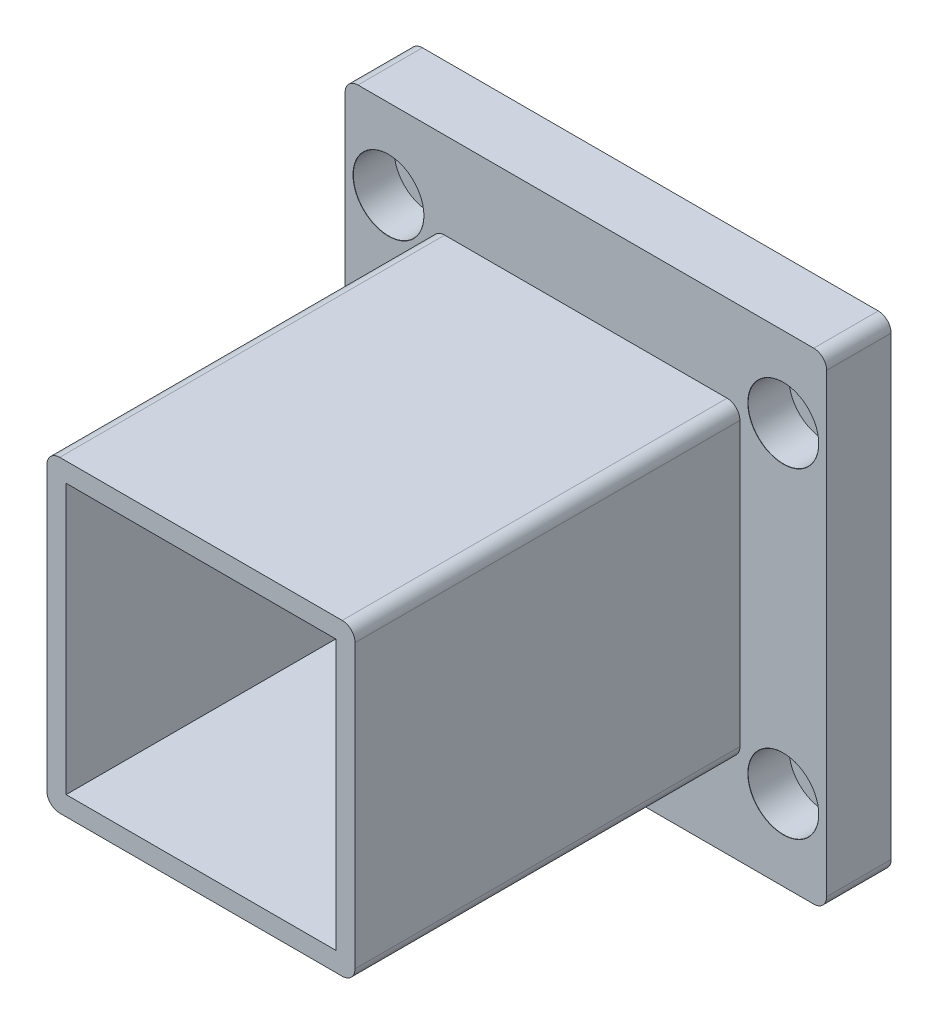
ISO-10303-21;
HEADER;
FILE_DESCRIPTION(('STEP AP214'),'2;1');
FILE_NAME('part.step','',(''),(''),'','','');
FILE_SCHEMA(('AUTOMOTIVE_DESIGN { 1 0 10303 214 1 1 1 1 }'));
ENDSEC;
DATA;
#1=APPLICATION_CONTEXT('core data for automotive mechanical design processes');
#2=APPLICATION_PROTOCOL_DEFINITION('international standard','automotive_design',2000,#1);
#3=PRODUCT_CONTEXT('',#1,'mechanical');
#4=PRODUCT('Part','Part','',(#3));
#5=PRODUCT_RELATED_PRODUCT_CATEGORY('part','',(#4));
#6=PRODUCT_DEFINITION_FORMATION('','',#4);
#7=PRODUCT_DEFINITION_CONTEXT('part definition',#1,'design');
#8=PRODUCT_DEFINITION('design','',#6,#7);
#9=PRODUCT_DEFINITION_SHAPE('','',#8);
#10=(LENGTH_UNIT() NAMED_UNIT(*) SI_UNIT(.MILLI.,.METRE.));
#11=(NAMED_UNIT(*) PLANE_ANGLE_UNIT() SI_UNIT($,.RADIAN.));
#12=(NAMED_UNIT(*) SI_UNIT($,.STERADIAN.) SOLID_ANGLE_UNIT());
#13=UNCERTAINTY_MEASURE_WITH_UNIT(LENGTH_MEASURE(1.E-05),#10,'distance_accuracy_value','');
#14=(GEOMETRIC_REPRESENTATION_CONTEXT(3) GLOBAL_UNCERTAINTY_ASSIGNED_CONTEXT((#13)) GLOBAL_UNIT_ASSIGNED_CONTEXT((#10,
#11,#12)) REPRESENTATION_CONTEXT('',''));
#15=CARTESIAN_POINT('',(0.,0.,0.));
#16=DIRECTION('',(0.,0.,1.));
#17=DIRECTION('',(1.,0.,0.));
#18=AXIS2_PLACEMENT_3D('',#15,#16,#17);
#19=CARTESIAN_POINT('',(0.,-22.0480038732877,65.));
#20=DIRECTION('',(0.,1.,0.));
#21=DIRECTION('',(-1.,0.,0.));
#22=AXIS2_PLACEMENT_3D('',#19,#20,#21);
#23=PLANE('',#22);
#24=DIRECTION('',(0.,0.,-1.));
#25=VECTOR('',#24,1.);
#26=CARTESIAN_POINT('',(14.8539056242526,-22.0480038732877,65.));
#27=LINE('',#26,#25);
#28=CARTESIAN_POINT('',(14.8539056242526,-22.0480038732877,65.));
#29=VERTEX_POINT('',#28);
#30=CARTESIAN_POINT('',(14.8539056242526,-22.0480038732877,0.));
#31=VERTEX_POINT('',#30);
#32=EDGE_CURVE('E238',#29,#31,#27,.T.);
#33=ORIENTED_EDGE('',*,*,#32,.T.);
#34=DIRECTION('',(1.,0.,0.));
#35=VECTOR('',#34,1.);
#36=CARTESIAN_POINT('',(0.,-22.0480038732877,0.));
#37=LINE('',#36,#35);
#38=CARTESIAN_POINT('',(-27.1460943757474,-22.0480038732877,0.));
#39=VERTEX_POINT('',#38);
#40=EDGE_CURVE('E232',#39,#31,#37,.T.);
#41=ORIENTED_EDGE('',*,*,#40,.F.);
#42=DIRECTION('',(0.,0.,-1.));
#43=VECTOR('',#42,1.);
#44=CARTESIAN_POINT('',(-27.1460943757474,-22.0480038732877,65.));
#45=LINE('',#44,#43);
#46=CARTESIAN_POINT('',(-27.1460943757474,-22.0480038732877,65.));
#47=VERTEX_POINT('',#46);
#48=EDGE_CURVE('E212',#47,#39,#45,.T.);
#49=ORIENTED_EDGE('',*,*,#48,.F.);
#50=DIRECTION('',(1.,0.,0.));
#51=VECTOR('',#50,1.);
#52=CARTESIAN_POINT('',(0.,-22.0480038732877,65.));
#53=LINE('',#52,#51);
#54=EDGE_CURVE('E393',#47,#29,#53,.T.);
#55=ORIENTED_EDGE('',*,*,#54,.T.);
#56=EDGE_LOOP('',(#33,#41,#49,#55));
#57=FACE_BOUND('',#56,.T.);
#58=ADVANCED_FACE('F73',(#57),#23,.T.);
#59=CARTESIAN_POINT('',(-27.1460943757474,0.,65.));
#60=DIRECTION('',(-1.,0.,0.));
#61=DIRECTION('',(0.,0.,1.));
#62=AXIS2_PLACEMENT_3D('',#59,#60,#61);
#63=PLANE('',#62);
#64=ORIENTED_EDGE('',*,*,#48,.T.);
#65=DIRECTION('',(0.,1.,0.));
#66=VECTOR('',#65,1.);
#67=CARTESIAN_POINT('',(-27.1460943757474,0.,0.));
#68=LINE('',#67,#66);
#69=CARTESIAN_POINT('',(-27.1460943757474,19.9519961267123,0.));
#70=VERTEX_POINT('',#69);
#71=EDGE_CURVE('E216',#39,#70,#68,.T.);
#72=ORIENTED_EDGE('',*,*,#71,.T.);
#73=DIRECTION('',(0.,0.,-1.));
#74=VECTOR('',#73,1.);
#75=CARTESIAN_POINT('',(-27.1460943757474,19.9519961267123,65.));
#76=LINE('',#75,#74);
#77=CARTESIAN_POINT('',(-27.1460943757474,19.9519961267123,65.));
#78=VERTEX_POINT('',#77);
#79=EDGE_CURVE('E225',#78,#70,#76,.T.);
#80=ORIENTED_EDGE('',*,*,#79,.F.);
#81=DIRECTION('',(0.,1.,0.));
#82=VECTOR('',#81,1.);
#83=CARTESIAN_POINT('',(-27.1460943757474,0.,65.));
#84=LINE('',#83,#82);
#85=EDGE_CURVE('E218',#47,#78,#84,.T.);
#86=ORIENTED_EDGE('',*,*,#85,.F.);
#87=EDGE_LOOP('',(#64,#72,#80,#86));
#88=FACE_BOUND('',#87,.T.);
#89=ADVANCED_FACE('F214',(#88),#63,.F.);
#90=CARTESIAN_POINT('',(0.,19.9519961267123,65.));
#91=DIRECTION('',(0.,1.,0.));
#92=DIRECTION('',(-1.,0.,0.));
#93=AXIS2_PLACEMENT_3D('',#90,#91,#92);
#94=PLANE('',#93);
#95=ORIENTED_EDGE('',*,*,#79,.T.);
#96=DIRECTION('',(1.,0.,0.));
#97=VECTOR('',#96,1.);
#98=CARTESIAN_POINT('',(0.,19.9519961267123,0.));
#99=LINE('',#98,#97);
#100=CARTESIAN_POINT('',(14.8539056242526,19.9519961267123,0.));
#101=VERTEX_POINT('',#100);
#102=EDGE_CURVE('E235',#70,#101,#99,.T.);
#103=ORIENTED_EDGE('',*,*,#102,.T.);
#104=DIRECTION('',(0.,0.,-1.));
#105=VECTOR('',#104,1.);
#106=CARTESIAN_POINT('',(14.8539056242526,19.9519961267123,65.));
#107=LINE('',#106,#105);
#108=CARTESIAN_POINT('',(14.8539056242526,19.9519961267123,65.));
#109=VERTEX_POINT('',#108);
#110=EDGE_CURVE('E258',#109,#101,#107,.T.);
#111=ORIENTED_EDGE('',*,*,#110,.F.);
#112=DIRECTION('',(1.,0.,0.));
#113=VECTOR('',#112,1.);
#114=CARTESIAN_POINT('',(0.,19.9519961267123,65.));
#115=LINE('',#114,#113);
#116=EDGE_CURVE('E403',#78,#109,#115,.T.);
#117=ORIENTED_EDGE('',*,*,#116,.F.);
#118=EDGE_LOOP('',(#95,#103,#111,#117));
#119=FACE_BOUND('',#118,.T.);
#120=ADVANCED_FACE('F412',(#119),#94,.F.);
#121=CARTESIAN_POINT('',(0.,22.9519961267123,65.));
#122=DIRECTION('',(0.,1.,0.));
#123=DIRECTION('',(-1.,0.,0.));
#124=AXIS2_PLACEMENT_3D('',#121,#122,#123);
#125=PLANE('',#124);
#126=DIRECTION('',(1.,0.,0.));
#127=VECTOR('',#126,1.);
#128=CARTESIAN_POINT('',(0.,22.9519961267123,5.04707913219928));
#129=LINE('',#128,#127);
#130=CARTESIAN_POINT('',(-28.1460943757474,22.9519961267123,5.04707913219928));
#131=VERTEX_POINT('',#130);
#132=CARTESIAN_POINT('',(15.8539056242526,22.9519961267123,5.04707913219928));
#133=VERTEX_POINT('',#132);
#134=EDGE_CURVE('E500',#131,#133,#129,.T.);
#135=ORIENTED_EDGE('',*,*,#134,.F.);
#136=DIRECTION('',(0.,0.,-1.));
#137=VECTOR('',#136,1.);
#138=CARTESIAN_POINT('',(-28.1460943757474,22.9519961267123,65.));
#139=LINE('',#138,#137);
#140=CARTESIAN_POINT('',(-28.1460943757474,22.9519961267123,65.));
#141=VERTEX_POINT('',#140);
#142=EDGE_CURVE('E273',#131,#141,#139,.F.);
#143=ORIENTED_EDGE('',*,*,#142,.T.);
#144=DIRECTION('',(1.,0.,0.));
#145=VECTOR('',#144,1.);
#146=CARTESIAN_POINT('',(0.,22.9519961267123,65.));
#147=LINE('',#146,#145);
#148=CARTESIAN_POINT('',(15.8539056242526,22.9519961267123,65.));
#149=VERTEX_POINT('',#148);
#150=EDGE_CURVE('E255',#141,#149,#147,.T.);
#151=ORIENTED_EDGE('',*,*,#150,.T.);
#152=DIRECTION('',(0.,0.,-1.));
#153=VECTOR('',#152,1.);
#154=CARTESIAN_POINT('',(15.8539056242526,22.9519961267123,5.04707913219928));
#155=LINE('',#154,#153);
#156=EDGE_CURVE('E269',#149,#133,#155,.T.);
#157=ORIENTED_EDGE('',*,*,#156,.T.);
#158=EDGE_LOOP('',(#135,#143,#151,#157));
#159=FACE_BOUND('',#158,.T.);
#160=ADVANCED_FACE('F414',(#159),#125,.T.);
#161=CARTESIAN_POINT('',(-30.1460943757474,0.,65.));
#162=DIRECTION('',(-1.,0.,0.));
#163=DIRECTION('',(0.,0.,1.));
#164=AXIS2_PLACEMENT_3D('',#161,#162,#163);
#165=PLANE('',#164);
#166=DIRECTION('',(0.,1.,0.));
#167=VECTOR('',#166,1.);
#168=CARTESIAN_POINT('',(-30.1460943757474,0.,65.));
#169=LINE('',#168,#167);
#170=CARTESIAN_POINT('',(-30.1460943757474,-23.0480038732877,65.));
#171=VERTEX_POINT('',#170);
#172=CARTESIAN_POINT('',(-30.1460943757474,20.9519961267123,65.));
#173=VERTEX_POINT('',#172);
#174=EDGE_CURVE('E398',#171,#173,#169,.T.);
#175=ORIENTED_EDGE('',*,*,#174,.T.);
#176=DIRECTION('',(0.,0.,-1.));
#177=VECTOR('',#176,1.);
#178=CARTESIAN_POINT('',(-30.1460943757474,20.9519961267123,65.));
#179=LINE('',#178,#177);
#180=CARTESIAN_POINT('',(-30.1460943757474,20.9519961267123,5.04707913219928));
#181=VERTEX_POINT('',#180);
#182=EDGE_CURVE('E265',#173,#181,#179,.T.);
#183=ORIENTED_EDGE('',*,*,#182,.T.);
#184=DIRECTION('',(0.,1.,0.));
#185=VECTOR('',#184,1.);
#186=CARTESIAN_POINT('',(-30.1460943757474,0.,5.04707913219928));
#187=LINE('',#186,#185);
#188=CARTESIAN_POINT('',(-30.1460943757474,-23.0480038732877,5.04707913219928));
#189=VERTEX_POINT('',#188);
#190=EDGE_CURVE('E376',#189,#181,#187,.T.);
#191=ORIENTED_EDGE('',*,*,#190,.F.);
#192=DIRECTION('',(0.,0.,-1.));
#193=VECTOR('',#192,1.);
#194=CARTESIAN_POINT('',(-30.1460943757474,-23.0480038732877,65.));
#195=LINE('',#194,#193);
#196=EDGE_CURVE('E224',#189,#171,#195,.F.);
#197=ORIENTED_EDGE('',*,*,#196,.T.);
#198=EDGE_LOOP('',(#175,#183,#191,#197));
#199=FACE_BOUND('',#198,.T.);
#200=ADVANCED_FACE('F421',(#199),#165,.T.);
#201=CARTESIAN_POINT('',(0.,-25.0480038732877,65.));
#202=DIRECTION('',(0.,1.,0.));
#203=DIRECTION('',(-1.,0.,0.));
#204=AXIS2_PLACEMENT_3D('',#201,#202,#203);
#205=PLANE('',#204);
#206=DIRECTION('',(1.,0.,0.));
#207=VECTOR('',#206,1.);
#208=CARTESIAN_POINT('',(0.,-25.0480038732877,65.));
#209=LINE('',#208,#207);
#210=CARTESIAN_POINT('',(-28.1460943757474,-25.0480038732877,65.));
#211=VERTEX_POINT('',#210);
#212=CARTESIAN_POINT('',(15.8539056242526,-25.0480038732877,65.));
#213=VERTEX_POINT('',#212);
#214=EDGE_CURVE('E388',#211,#213,#209,.T.);
#215=ORIENTED_EDGE('',*,*,#214,.F.);
#216=DIRECTION('',(0.,0.,-1.));
#217=VECTOR('',#216,1.);
#218=CARTESIAN_POINT('',(-28.1460943757474,-25.0480038732877,5.04707913219928));
#219=LINE('',#218,#217);
#220=CARTESIAN_POINT('',(-28.1460943757474,-25.0480038732877,5.04707913219928));
#221=VERTEX_POINT('',#220);
#222=EDGE_CURVE('E291',#211,#221,#219,.T.);
#223=ORIENTED_EDGE('',*,*,#222,.T.);
#224=DIRECTION('',(1.,0.,0.));
#225=VECTOR('',#224,1.);
#226=CARTESIAN_POINT('',(0.,-25.0480038732877,5.04707913219928));
#227=LINE('',#226,#225);
#228=CARTESIAN_POINT('',(15.8539056242526,-25.0480038732877,5.04707913219928));
#229=VERTEX_POINT('',#228);
#230=EDGE_CURVE('E364',#221,#229,#227,.T.);
#231=ORIENTED_EDGE('',*,*,#230,.T.);
#232=DIRECTION('',(0.,0.,-1.));
#233=VECTOR('',#232,1.);
#234=CARTESIAN_POINT('',(15.8539056242526,-25.0480038732877,65.));
#235=LINE('',#234,#233);
#236=EDGE_CURVE('E288',#229,#213,#235,.F.);
#237=ORIENTED_EDGE('',*,*,#236,.T.);
#238=EDGE_LOOP('',(#215,#223,#231,#237));
#239=FACE_BOUND('',#238,.T.);
#240=ADVANCED_FACE('F372',(#239),#205,.F.);
#241=CARTESIAN_POINT('',(17.8539056242526,0.,65.));
#242=DIRECTION('',(-1.,0.,0.));
#243=DIRECTION('',(0.,0.,1.));
#244=AXIS2_PLACEMENT_3D('',#241,#242,#243);
#245=PLANE('',#244);
#246=DIRECTION('',(0.,1.,0.));
#247=VECTOR('',#246,1.);
#248=CARTESIAN_POINT('',(17.8539056242526,0.,65.));
#249=LINE('',#248,#247);
#250=CARTESIAN_POINT('',(17.8539056242526,-23.0480038732877,65.));
#251=VERTEX_POINT('',#250);
#252=CARTESIAN_POINT('',(17.8539056242526,20.9519961267123,65.));
#253=VERTEX_POINT('',#252);
#254=EDGE_CURVE('E386',#251,#253,#249,.T.);
#255=ORIENTED_EDGE('',*,*,#254,.F.);
#256=DIRECTION('',(0.,0.,-1.));
#257=VECTOR('',#256,1.);
#258=CARTESIAN_POINT('',(17.8539056242526,-23.0480038732877,65.));
#259=LINE('',#258,#257);
#260=CARTESIAN_POINT('',(17.8539056242526,-23.0480038732877,5.04707913219928));
#261=VERTEX_POINT('',#260);
#262=EDGE_CURVE('E298',#251,#261,#259,.T.);
#263=ORIENTED_EDGE('',*,*,#262,.T.);
#264=DIRECTION('',(0.,1.,0.));
#265=VECTOR('',#264,1.);
#266=CARTESIAN_POINT('',(17.8539056242526,0.,5.04707913219928));
#267=LINE('',#266,#265);
#268=CARTESIAN_POINT('',(17.8539056242526,20.9519961267123,5.04707913219928));
#269=VERTEX_POINT('',#268);
#270=EDGE_CURVE('E366',#261,#269,#267,.T.);
#271=ORIENTED_EDGE('',*,*,#270,.T.);
#272=DIRECTION('',(0.,0.,-1.));
#273=VECTOR('',#272,1.);
#274=CARTESIAN_POINT('',(17.8539056242526,20.9519961267123,65.));
#275=LINE('',#274,#273);
#276=EDGE_CURVE('E295',#269,#253,#275,.F.);
#277=ORIENTED_EDGE('',*,*,#276,.T.);
#278=EDGE_LOOP('',(#255,#263,#271,#277));
#279=FACE_BOUND('',#278,.T.);
#280=ADVANCED_FACE('F390',(#279),#245,.F.);
#281=CARTESIAN_POINT('',(14.8539056242526,0.,65.));
#282=DIRECTION('',(-1.,0.,0.));
#283=DIRECTION('',(0.,0.,1.));
#284=AXIS2_PLACEMENT_3D('',#281,#282,#283);
#285=PLANE('',#284);
#286=ORIENTED_EDGE('',*,*,#110,.T.);
#287=DIRECTION('',(0.,1.,0.));
#288=VECTOR('',#287,1.);
#289=CARTESIAN_POINT('',(14.8539056242526,0.,0.));
#290=LINE('',#289,#288);
#291=EDGE_CURVE('E252',#31,#101,#290,.T.);
#292=ORIENTED_EDGE('',*,*,#291,.F.);
#293=ORIENTED_EDGE('',*,*,#32,.F.);
#294=DIRECTION('',(0.,1.,0.));
#295=VECTOR('',#294,1.);
#296=CARTESIAN_POINT('',(14.8539056242526,0.,65.));
#297=LINE('',#296,#295);
#298=EDGE_CURVE('E247',#29,#109,#297,.T.);
#299=ORIENTED_EDGE('',*,*,#298,.T.);
#300=EDGE_LOOP('',(#286,#292,#293,#299));
#301=FACE_BOUND('',#300,.T.);
#302=ADVANCED_FACE('F410',(#301),#285,.T.);
#303=CARTESIAN_POINT('',(0.,0.,65.));
#304=DIRECTION('',(0.,0.,1.));
#305=DIRECTION('',(1.,0.,0.));
#306=AXIS2_PLACEMENT_3D('',#303,#304,#305);
#307=PLANE('',#306);
#308=ORIENTED_EDGE('',*,*,#150,.F.);
#309=CARTESIAN_POINT('',(-28.1460943757474,20.9519961267123,65.));
#310=DIRECTION('',(0.,0.,1.));
#311=DIRECTION('',(1.,0.,0.));
#312=AXIS2_PLACEMENT_3D('',#309,#310,#311);
#313=CIRCLE('',#312,2.);
#314=EDGE_CURVE('E285',#141,#173,#313,.T.);
#315=ORIENTED_EDGE('',*,*,#314,.T.);
#316=ORIENTED_EDGE('',*,*,#174,.F.);
#317=CARTESIAN_POINT('',(-28.1460943757474,-23.0480038732877,65.));
#318=DIRECTION('',(0.,0.,1.));
#319=DIRECTION('',(1.,0.,0.));
#320=AXIS2_PLACEMENT_3D('',#317,#318,#319);
#321=CIRCLE('',#320,2.);
#322=EDGE_CURVE('E282',#171,#211,#321,.T.);
#323=ORIENTED_EDGE('',*,*,#322,.T.);
#324=ORIENTED_EDGE('',*,*,#214,.T.);
#325=CARTESIAN_POINT('',(15.8539056242526,-23.0480038732877,65.));
#326=DIRECTION('',(0.,0.,1.));
#327=DIRECTION('',(1.,0.,0.));
#328=AXIS2_PLACEMENT_3D('',#325,#326,#327);
#329=CIRCLE('',#328,2.);
#330=EDGE_CURVE('E279',#213,#251,#329,.T.);
#331=ORIENTED_EDGE('',*,*,#330,.T.);
#332=ORIENTED_EDGE('',*,*,#254,.T.);
#333=CARTESIAN_POINT('',(15.8539056242526,20.9519961267123,65.));
#334=DIRECTION('',(0.,0.,1.));
#335=DIRECTION('',(1.,0.,0.));
#336=AXIS2_PLACEMENT_3D('',#333,#334,#335);
#337=CIRCLE('',#336,2.);
#338=EDGE_CURVE('E276',#253,#149,#337,.T.);
#339=ORIENTED_EDGE('',*,*,#338,.T.);
#340=EDGE_LOOP('',(#308,#315,#316,#323,#324,#331,#332,#339));
#341=FACE_BOUND('',#340,.T.);
#342=ORIENTED_EDGE('',*,*,#54,.F.);
#343=ORIENTED_EDGE('',*,*,#85,.T.);
#344=ORIENTED_EDGE('',*,*,#116,.T.);
#345=ORIENTED_EDGE('',*,*,#298,.F.);
#346=EDGE_LOOP('',(#342,#343,#344,#345));
#347=FACE_BOUND('',#346,.T.);
#348=ADVANCED_FACE('F384',(#341,#347),#307,.T.);
#349=CARTESIAN_POINT('',(0.,0.,0.));
#350=DIRECTION('',(0.,0.,-1.));
#351=DIRECTION('',(-1.,0.,0.));
#352=AXIS2_PLACEMENT_3D('',#349,#350,#351);
#353=PLANE('',#352);
#354=ORIENTED_EDGE('',*,*,#71,.F.);
#355=ORIENTED_EDGE('',*,*,#40,.T.);
#356=ORIENTED_EDGE('',*,*,#291,.T.);
#357=ORIENTED_EDGE('',*,*,#102,.F.);
#358=EDGE_LOOP('',(#354,#355,#356,#357));
#359=FACE_BOUND('',#358,.T.);
#360=ADVANCED_FACE('F230',(#359),#353,.F.);
#361=CARTESIAN_POINT('',(0.,0.,5.04707913219928));
#362=DIRECTION('',(0.,0.,1.));
#363=DIRECTION('',(1.,0.,0.));
#364=AXIS2_PLACEMENT_3D('',#361,#362,#363);
#365=PLANE('',#364);
#366=CARTESIAN_POINT('',(-36.8960943757474,23.9519961267123,5.04707913219928));
#367=DIRECTION('',(0.,0.,1.));
#368=DIRECTION('',(1.,0.,0.));
#369=AXIS2_PLACEMENT_3D('',#366,#367,#368);
#370=CIRCLE('',#369,5.525);
#371=CARTESIAN_POINT('',(-31.3710943757474,23.9519961267123,5.04707913219928));
#372=VERTEX_POINT('',#371);
#373=EDGE_CURVE('E975',#372,#372,#370,.T.);
#374=ORIENTED_EDGE('',*,*,#373,.F.);
#375=EDGE_LOOP('',(#374));
#376=FACE_BOUND('',#375,.T.);
#377=CARTESIAN_POINT('',(-36.8960943757474,-26.0480038732877,5.04707913219928));
#378=DIRECTION('',(0.,0.,1.));
#379=DIRECTION('',(1.,0.,0.));
#380=AXIS2_PLACEMENT_3D('',#377,#378,#379);
#381=CIRCLE('',#380,5.525);
#382=CARTESIAN_POINT('',(-31.3710943757474,-26.0480038732877,5.04707913219928));
#383=VERTEX_POINT('',#382);
#384=EDGE_CURVE('E957',#383,#383,#381,.T.);
#385=ORIENTED_EDGE('',*,*,#384,.F.);
#386=EDGE_LOOP('',(#385));
#387=FACE_BOUND('',#386,.T.);
#388=CARTESIAN_POINT('',(24.6039056242526,23.9519961267123,5.04707913219928));
#389=DIRECTION('',(0.,0.,1.));
#390=DIRECTION('',(1.,0.,0.));
#391=AXIS2_PLACEMENT_3D('',#388,#389,#390);
#392=CIRCLE('',#391,5.525);
#393=CARTESIAN_POINT('',(30.1289056242526,23.9519961267123,5.04707913219928));
#394=VERTEX_POINT('',#393);
#395=EDGE_CURVE('E939',#394,#394,#392,.T.);
#396=ORIENTED_EDGE('',*,*,#395,.F.);
#397=EDGE_LOOP('',(#396));
#398=FACE_BOUND('',#397,.T.);
#399=CARTESIAN_POINT('',(24.6039056242526,-26.0480038732877,5.04707913219928));
#400=DIRECTION('',(0.,0.,1.));
#401=DIRECTION('',(1.,0.,0.));
#402=AXIS2_PLACEMENT_3D('',#399,#400,#401);
#403=CIRCLE('',#402,5.525);
#404=CARTESIAN_POINT('',(30.1289056242526,-26.0480038732877,5.04707913219928));
#405=VERTEX_POINT('',#404);
#406=EDGE_CURVE('E921',#405,#405,#403,.T.);
#407=ORIENTED_EDGE('',*,*,#406,.F.);
#408=EDGE_LOOP('',(#407));
#409=FACE_BOUND('',#408,.T.);
#410=ORIENTED_EDGE('',*,*,#230,.F.);
#411=CARTESIAN_POINT('',(-28.1460943757474,-23.0480038732877,5.04707913219928));
#412=DIRECTION('',(0.,0.,1.));
#413=DIRECTION('',(1.,0.,0.));
#414=AXIS2_PLACEMENT_3D('',#411,#412,#413);
#415=CIRCLE('',#414,2.);
#416=EDGE_CURVE('E355',#221,#189,#415,.F.);
#417=ORIENTED_EDGE('',*,*,#416,.T.);
#418=ORIENTED_EDGE('',*,*,#190,.T.);
#419=CARTESIAN_POINT('',(-28.1460943757474,20.9519961267123,5.04707913219928));
#420=DIRECTION('',(0.,0.,1.));
#421=DIRECTION('',(1.,0.,0.));
#422=AXIS2_PLACEMENT_3D('',#419,#420,#421);
#423=CIRCLE('',#422,2.);
#424=EDGE_CURVE('E352',#181,#131,#423,.F.);
#425=ORIENTED_EDGE('',*,*,#424,.T.);
#426=ORIENTED_EDGE('',*,*,#134,.T.);
#427=CARTESIAN_POINT('',(15.8539056242526,20.9519961267123,5.04707913219928));
#428=DIRECTION('',(0.,0.,1.));
#429=DIRECTION('',(1.,0.,0.));
#430=AXIS2_PLACEMENT_3D('',#427,#428,#429);
#431=CIRCLE('',#430,2.);
#432=EDGE_CURVE('E12',#133,#269,#431,.F.);
#433=ORIENTED_EDGE('',*,*,#432,.T.);
#434=ORIENTED_EDGE('',*,*,#270,.F.);
#435=CARTESIAN_POINT('',(15.8539056242526,-23.0480038732877,5.04707913219928));
#436=DIRECTION('',(0.,0.,1.));
#437=DIRECTION('',(1.,0.,0.));
#438=AXIS2_PLACEMENT_3D('',#435,#436,#437);
#439=CIRCLE('',#438,2.);
#440=EDGE_CURVE('E82',#261,#229,#439,.F.);
#441=ORIENTED_EDGE('',*,*,#440,.T.);
#442=EDGE_LOOP('',(#410,#417,#418,#425,#426,#433,#434,#441));
#443=FACE_BOUND('',#442,.T.);
#444=DIRECTION('',(0.,1.,0.));
#445=VECTOR('',#444,1.);
#446=CARTESIAN_POINT('',(31.3539056242527,36.4519961267123,5.04707913219928));
#447=LINE('',#446,#445);
#448=CARTESIAN_POINT('',(31.3539056242526,-36.5480038732877,5.04707913219928));
#449=VERTEX_POINT('',#448);
#450=CARTESIAN_POINT('',(31.3539056242527,34.4519961267123,5.04707913219928));
#451=VERTEX_POINT('',#450);
#452=EDGE_CURVE('E483',#449,#451,#447,.T.);
#453=ORIENTED_EDGE('',*,*,#452,.T.);
#454=CARTESIAN_POINT('',(29.3539056242526,34.4519961267123,5.04707913219928));
#455=DIRECTION('',(0.,0.,1.));
#456=DIRECTION('',(1.,0.,0.));
#457=AXIS2_PLACEMENT_3D('',#454,#455,#456);
#458=CIRCLE('',#457,2.);
#459=CARTESIAN_POINT('',(29.3539056242526,36.4519961267123,5.04707913219928));
#460=VERTEX_POINT('',#459);
#461=EDGE_CURVE('E318',#451,#460,#458,.T.);
#462=ORIENTED_EDGE('',*,*,#461,.T.);
#463=DIRECTION('',(-1.,0.,0.));
#464=VECTOR('',#463,1.);
#465=CARTESIAN_POINT('',(-43.6460943757474,36.4519961267123,5.04707913219928));
#466=LINE('',#465,#464);
#467=CARTESIAN_POINT('',(-41.6460943757474,36.4519961267123,5.04707913219928));
#468=VERTEX_POINT('',#467);
#469=EDGE_CURVE('E492',#460,#468,#466,.T.);
#470=ORIENTED_EDGE('',*,*,#469,.T.);
#471=CARTESIAN_POINT('',(-41.6460943757474,34.4519961267123,5.04707913219928));
#472=DIRECTION('',(0.,0.,1.));
#473=DIRECTION('',(1.,0.,0.));
#474=AXIS2_PLACEMENT_3D('',#471,#472,#473);
#475=CIRCLE('',#474,2.);
#476=CARTESIAN_POINT('',(-43.6460943757474,34.4519961267123,5.04707913219928));
#477=VERTEX_POINT('',#476);
#478=EDGE_CURVE('E315',#468,#477,#475,.T.);
#479=ORIENTED_EDGE('',*,*,#478,.T.);
#480=DIRECTION('',(0.,-1.,0.));
#481=VECTOR('',#480,1.);
#482=CARTESIAN_POINT('',(-43.6460943757474,36.4519961267123,5.04707913219928));
#483=LINE('',#482,#481);
#484=CARTESIAN_POINT('',(-43.6460943757473,-36.5480038732877,5.04707913219928));
#485=VERTEX_POINT('',#484);
#486=EDGE_CURVE('E472',#477,#485,#483,.T.);
#487=ORIENTED_EDGE('',*,*,#486,.T.);
#488=CARTESIAN_POINT('',(-41.6460943757474,-36.5480038732877,5.04707913219928));
#489=DIRECTION('',(0.,0.,1.));
#490=DIRECTION('',(1.,0.,0.));
#491=AXIS2_PLACEMENT_3D('',#488,#489,#490);
#492=CIRCLE('',#491,2.);
#493=CARTESIAN_POINT('',(-41.6460943757474,-38.5480038732877,5.04707913219928));
#494=VERTEX_POINT('',#493);
#495=EDGE_CURVE('E312',#485,#494,#492,.T.);
#496=ORIENTED_EDGE('',*,*,#495,.T.);
#497=DIRECTION('',(1.,0.,0.));
#498=VECTOR('',#497,1.);
#499=CARTESIAN_POINT('',(-43.6460943757473,-38.5480038732877,5.04707913219928));
#500=LINE('',#499,#498);
#501=CARTESIAN_POINT('',(29.3539056242526,-38.5480038732877,5.04707913219928));
#502=VERTEX_POINT('',#501);
#503=EDGE_CURVE('E478',#494,#502,#500,.T.);
#504=ORIENTED_EDGE('',*,*,#503,.T.);
#505=CARTESIAN_POINT('',(29.3539056242526,-36.5480038732877,5.04707913219928));
#506=DIRECTION('',(0.,0.,1.));
#507=DIRECTION('',(1.,0.,0.));
#508=AXIS2_PLACEMENT_3D('',#505,#506,#507);
#509=CIRCLE('',#508,2.);
#510=EDGE_CURVE('E309',#502,#449,#509,.T.);
#511=ORIENTED_EDGE('',*,*,#510,.T.);
#512=EDGE_LOOP('',(#453,#462,#470,#479,#487,#496,#504,#511));
#513=FACE_BOUND('',#512,.T.);
#514=ADVANCED_FACE('F362',(#376,#387,#398,#409,#443,#513),#365,.T.);
#515=CARTESIAN_POINT('',(0.,0.,-5.));
#516=DIRECTION('',(0.,0.,-1.));
#517=DIRECTION('',(-1.,0.,0.));
#518=AXIS2_PLACEMENT_3D('',#515,#516,#517);
#519=PLANE('',#518);
#520=CARTESIAN_POINT('',(-36.8960943757474,23.9519961267123,-5.));
#521=DIRECTION('',(0.,0.,1.));
#522=DIRECTION('',(1.,0.,0.));
#523=AXIS2_PLACEMENT_3D('',#520,#521,#522);
#524=CIRCLE('',#523,3.3);
#525=CARTESIAN_POINT('',(-33.5960943757474,23.9519961267123,-5.));
#526=VERTEX_POINT('',#525);
#527=EDGE_CURVE('E898',#526,#526,#524,.T.);
#528=ORIENTED_EDGE('',*,*,#527,.T.);
#529=EDGE_LOOP('',(#528));
#530=FACE_BOUND('',#529,.T.);
#531=CARTESIAN_POINT('',(-36.8960943757474,-26.0480038732877,-5.));
#532=DIRECTION('',(0.,0.,1.));
#533=DIRECTION('',(1.,0.,0.));
#534=AXIS2_PLACEMENT_3D('',#531,#532,#533);
#535=CIRCLE('',#534,3.3);
#536=CARTESIAN_POINT('',(-33.5960943757474,-26.0480038732877,-5.));
#537=VERTEX_POINT('',#536);
#538=EDGE_CURVE('E902',#537,#537,#535,.T.);
#539=ORIENTED_EDGE('',*,*,#538,.T.);
#540=EDGE_LOOP('',(#539));
#541=FACE_BOUND('',#540,.T.);
#542=CARTESIAN_POINT('',(24.6039056242526,23.9519961267123,-5.));
#543=DIRECTION('',(0.,0.,1.));
#544=DIRECTION('',(1.,0.,0.));
#545=AXIS2_PLACEMENT_3D('',#542,#543,#544);
#546=CIRCLE('',#545,3.3);
#547=CARTESIAN_POINT('',(27.9039056242526,23.9519961267123,-5.));
#548=VERTEX_POINT('',#547);
#549=EDGE_CURVE('E906',#548,#548,#546,.T.);
#550=ORIENTED_EDGE('',*,*,#549,.T.);
#551=EDGE_LOOP('',(#550));
#552=FACE_BOUND('',#551,.T.);
#553=CARTESIAN_POINT('',(24.6039056242526,-26.0480038732877,-5.));
#554=DIRECTION('',(0.,0.,1.));
#555=DIRECTION('',(1.,0.,0.));
#556=AXIS2_PLACEMENT_3D('',#553,#554,#555);
#557=CIRCLE('',#556,3.3);
#558=CARTESIAN_POINT('',(27.9039056242526,-26.0480038732877,-5.));
#559=VERTEX_POINT('',#558);
#560=EDGE_CURVE('E479',#559,#559,#557,.T.);
#561=ORIENTED_EDGE('',*,*,#560,.T.);
#562=EDGE_LOOP('',(#561));
#563=FACE_BOUND('',#562,.T.);
#564=DIRECTION('',(1.,0.,0.));
#565=VECTOR('',#564,1.);
#566=CARTESIAN_POINT('',(0.,36.4519961267123,-5.));
#567=LINE('',#566,#565);
#568=CARTESIAN_POINT('',(-41.6460943757474,36.4519961267123,-5.));
#569=VERTEX_POINT('',#568);
#570=CARTESIAN_POINT('',(29.3539056242526,36.4519961267123,-5.));
#571=VERTEX_POINT('',#570);
#572=EDGE_CURVE('E240',#569,#571,#567,.T.);
#573=ORIENTED_EDGE('',*,*,#572,.T.);
#574=CARTESIAN_POINT('',(29.3539056242526,34.4519961267123,-5.));
#575=DIRECTION('',(0.,0.,-1.));
#576=DIRECTION('',(-1.,0.,0.));
#577=AXIS2_PLACEMENT_3D('',#574,#575,#576);
#578=CIRCLE('',#577,2.);
#579=CARTESIAN_POINT('',(31.3539056242526,34.4519961267123,-5.));
#580=VERTEX_POINT('',#579);
#581=EDGE_CURVE('E336',#571,#580,#578,.T.);
#582=ORIENTED_EDGE('',*,*,#581,.T.);
#583=DIRECTION('',(0.,1.,0.));
#584=VECTOR('',#583,1.);
#585=CARTESIAN_POINT('',(31.3539056242526,0.,-5.));
#586=LINE('',#585,#584);
#587=CARTESIAN_POINT('',(31.3539056242526,-36.5480038732877,-5.));
#588=VERTEX_POINT('',#587);
#589=EDGE_CURVE('E504',#588,#580,#586,.T.);
#590=ORIENTED_EDGE('',*,*,#589,.F.);
#591=CARTESIAN_POINT('',(29.3539056242526,-36.5480038732877,-5.));
#592=DIRECTION('',(0.,0.,-1.));
#593=DIRECTION('',(-1.,0.,0.));
#594=AXIS2_PLACEMENT_3D('',#591,#592,#593);
#595=CIRCLE('',#594,2.);
#596=CARTESIAN_POINT('',(29.3539056242526,-38.5480038732877,-5.));
#597=VERTEX_POINT('',#596);
#598=EDGE_CURVE('E328',#588,#597,#595,.T.);
#599=ORIENTED_EDGE('',*,*,#598,.T.);
#600=DIRECTION('',(1.,0.,0.));
#601=VECTOR('',#600,1.);
#602=CARTESIAN_POINT('',(0.,-38.5480038732877,-5.));
#603=LINE('',#602,#601);
#604=CARTESIAN_POINT('',(-41.6460943757474,-38.5480038732877,-5.));
#605=VERTEX_POINT('',#604);
#606=EDGE_CURVE('E508',#605,#597,#603,.T.);
#607=ORIENTED_EDGE('',*,*,#606,.F.);
#608=CARTESIAN_POINT('',(-41.6460943757474,-36.5480038732877,-5.));
#609=DIRECTION('',(0.,0.,-1.));
#610=DIRECTION('',(-1.,0.,0.));
#611=AXIS2_PLACEMENT_3D('',#608,#609,#610);
#612=CIRCLE('',#611,2.);
#613=CARTESIAN_POINT('',(-43.6460943757474,-36.5480038732877,-5.));
#614=VERTEX_POINT('',#613);
#615=EDGE_CURVE('E96',#605,#614,#612,.T.);
#616=ORIENTED_EDGE('',*,*,#615,.T.);
#617=DIRECTION('',(0.,1.,0.));
#618=VECTOR('',#617,1.);
#619=CARTESIAN_POINT('',(-43.6460943757474,0.,-5.));
#620=LINE('',#619,#618);
#621=CARTESIAN_POINT('',(-43.6460943757474,34.4519961267123,-5.));
#622=VERTEX_POINT('',#621);
#623=EDGE_CURVE('E244',#614,#622,#620,.T.);
#624=ORIENTED_EDGE('',*,*,#623,.T.);
#625=CARTESIAN_POINT('',(-41.6460943757474,34.4519961267123,-5.));
#626=DIRECTION('',(0.,0.,-1.));
#627=DIRECTION('',(-1.,0.,0.));
#628=AXIS2_PLACEMENT_3D('',#625,#626,#627);
#629=CIRCLE('',#628,2.);
#630=EDGE_CURVE('E333',#622,#569,#629,.T.);
#631=ORIENTED_EDGE('',*,*,#630,.T.);
#632=EDGE_LOOP('',(#573,#582,#590,#599,#607,#616,#624,#631));
#633=FACE_BOUND('',#632,.T.);
#634=ADVANCED_FACE('F528',(#530,#541,#552,#563,#633),#519,.T.);
#635=CARTESIAN_POINT('',(0.,36.4519961267123,-5.));
#636=DIRECTION('',(0.,-1.,0.));
#637=DIRECTION('',(0.,0.,-1.));
#638=AXIS2_PLACEMENT_3D('',#635,#636,#637);
#639=PLANE('',#638);
#640=ORIENTED_EDGE('',*,*,#469,.F.);
#641=DIRECTION('',(0.,0.,1.));
#642=VECTOR('',#641,1.);
#643=CARTESIAN_POINT('',(29.3539056242526,36.4519961267123,-5.));
#644=LINE('',#643,#642);
#645=EDGE_CURVE('E325',#460,#571,#644,.F.);
#646=ORIENTED_EDGE('',*,*,#645,.T.);
#647=ORIENTED_EDGE('',*,*,#572,.F.);
#648=DIRECTION('',(0.,0.,1.));
#649=VECTOR('',#648,1.);
#650=CARTESIAN_POINT('',(-41.6460943757474,36.4519961267123,-5.));
#651=LINE('',#650,#649);
#652=EDGE_CURVE('E321',#569,#468,#651,.T.);
#653=ORIENTED_EDGE('',*,*,#652,.T.);
#654=EDGE_LOOP('',(#640,#646,#647,#653));
#655=FACE_BOUND('',#654,.T.);
#656=ADVANCED_FACE('F533',(#655),#639,.F.);
#657=CARTESIAN_POINT('',(31.3539056242526,0.,-5.));
#658=DIRECTION('',(1.,0.,0.));
#659=DIRECTION('',(0.,1.,0.));
#660=AXIS2_PLACEMENT_3D('',#657,#658,#659);
#661=PLANE('',#660);
#662=ORIENTED_EDGE('',*,*,#589,.T.);
#663=DIRECTION('',(0.,0.,1.));
#664=VECTOR('',#663,1.);
#665=CARTESIAN_POINT('',(31.3539056242526,34.4519961267123,5.04707913219928));
#666=LINE('',#665,#664);
#667=EDGE_CURVE('E305',#580,#451,#666,.T.);
#668=ORIENTED_EDGE('',*,*,#667,.T.);
#669=ORIENTED_EDGE('',*,*,#452,.F.);
#670=DIRECTION('',(0.,0.,1.));
#671=VECTOR('',#670,1.);
#672=CARTESIAN_POINT('',(31.3539056242526,-36.5480038732877,-5.));
#673=LINE('',#672,#671);
#674=EDGE_CURVE('E302',#449,#588,#673,.F.);
#675=ORIENTED_EDGE('',*,*,#674,.T.);
#676=EDGE_LOOP('',(#662,#668,#669,#675));
#677=FACE_BOUND('',#676,.T.);
#678=ADVANCED_FACE('F539',(#677),#661,.T.);
#679=CARTESIAN_POINT('',(0.,-38.5480038732877,-5.));
#680=DIRECTION('',(0.,-1.,0.));
#681=DIRECTION('',(0.,0.,-1.));
#682=AXIS2_PLACEMENT_3D('',#679,#680,#681);
#683=PLANE('',#682);
#684=ORIENTED_EDGE('',*,*,#503,.F.);
#685=DIRECTION('',(0.,0.,1.));
#686=VECTOR('',#685,1.);
#687=CARTESIAN_POINT('',(-41.6460943757474,-38.5480038732877,-5.));
#688=LINE('',#687,#686);
#689=EDGE_CURVE('E349',#494,#605,#688,.F.);
#690=ORIENTED_EDGE('',*,*,#689,.T.);
#691=ORIENTED_EDGE('',*,*,#606,.T.);
#692=DIRECTION('',(0.,0.,1.));
#693=VECTOR('',#692,1.);
#694=CARTESIAN_POINT('',(29.3539056242526,-38.5480038732877,-5.));
#695=LINE('',#694,#693);
#696=EDGE_CURVE('E345',#597,#502,#695,.T.);
#697=ORIENTED_EDGE('',*,*,#696,.T.);
#698=EDGE_LOOP('',(#684,#690,#691,#697));
#699=FACE_BOUND('',#698,.T.);
#700=ADVANCED_FACE('F545',(#699),#683,.T.);
#701=CARTESIAN_POINT('',(-43.6460943757474,0.,-5.));
#702=DIRECTION('',(1.,0.,0.));
#703=DIRECTION('',(0.,1.,0.));
#704=AXIS2_PLACEMENT_3D('',#701,#702,#703);
#705=PLANE('',#704);
#706=ORIENTED_EDGE('',*,*,#486,.F.);
#707=DIRECTION('',(0.,0.,1.));
#708=VECTOR('',#707,1.);
#709=CARTESIAN_POINT('',(-43.6460943757474,34.4519961267123,-5.));
#710=LINE('',#709,#708);
#711=EDGE_CURVE('E89',#477,#622,#710,.F.);
#712=ORIENTED_EDGE('',*,*,#711,.T.);
#713=ORIENTED_EDGE('',*,*,#623,.F.);
#714=DIRECTION('',(0.,0.,1.));
#715=VECTOR('',#714,1.);
#716=CARTESIAN_POINT('',(-43.6460943757474,-36.5480038732877,5.04707913219928));
#717=LINE('',#716,#715);
#718=EDGE_CURVE('E339',#614,#485,#717,.T.);
#719=ORIENTED_EDGE('',*,*,#718,.T.);
#720=EDGE_LOOP('',(#706,#712,#713,#719));
#721=FACE_BOUND('',#720,.T.);
#722=ADVANCED_FACE('F443',(#721),#705,.F.);
#723=CARTESIAN_POINT('',(-28.1460943757474,20.9519961267123,65.));
#724=DIRECTION('',(0.,0.,-1.));
#725=DIRECTION('',(-1.,0.,0.));
#726=AXIS2_PLACEMENT_3D('',#723,#724,#725);
#727=CYLINDRICAL_SURFACE('',#726,2.);
#728=ORIENTED_EDGE('',*,*,#314,.F.);
#729=ORIENTED_EDGE('',*,*,#142,.F.);
#730=ORIENTED_EDGE('',*,*,#424,.F.);
#731=ORIENTED_EDGE('',*,*,#182,.F.);
#732=EDGE_LOOP('',(#728,#729,#730,#731));
#733=FACE_BOUND('',#732,.T.);
#734=ADVANCED_FACE('F439',(#733),#727,.T.);
#735=CARTESIAN_POINT('',(-28.1460943757474,-23.0480038732877,65.));
#736=DIRECTION('',(0.,0.,1.));
#737=DIRECTION('',(1.,0.,0.));
#738=AXIS2_PLACEMENT_3D('',#735,#736,#737);
#739=CYLINDRICAL_SURFACE('',#738,2.);
#740=ORIENTED_EDGE('',*,*,#322,.F.);
#741=ORIENTED_EDGE('',*,*,#196,.F.);
#742=ORIENTED_EDGE('',*,*,#416,.F.);
#743=ORIENTED_EDGE('',*,*,#222,.F.);
#744=EDGE_LOOP('',(#740,#741,#742,#743));
#745=FACE_BOUND('',#744,.T.);
#746=ADVANCED_FACE('F442',(#745),#739,.T.);
#747=CARTESIAN_POINT('',(15.8539056242526,-23.0480038732877,65.));
#748=DIRECTION('',(0.,0.,-1.));
#749=DIRECTION('',(-1.,0.,0.));
#750=AXIS2_PLACEMENT_3D('',#747,#748,#749);
#751=CYLINDRICAL_SURFACE('',#750,2.);
#752=ORIENTED_EDGE('',*,*,#330,.F.);
#753=ORIENTED_EDGE('',*,*,#236,.F.);
#754=ORIENTED_EDGE('',*,*,#440,.F.);
#755=ORIENTED_EDGE('',*,*,#262,.F.);
#756=EDGE_LOOP('',(#752,#753,#754,#755));
#757=FACE_BOUND('',#756,.T.);
#758=ADVANCED_FACE('F379',(#757),#751,.T.);
#759=CARTESIAN_POINT('',(15.8539056242526,20.9519961267123,65.));
#760=DIRECTION('',(0.,0.,1.));
#761=DIRECTION('',(1.,0.,0.));
#762=AXIS2_PLACEMENT_3D('',#759,#760,#761);
#763=CYLINDRICAL_SURFACE('',#762,2.);
#764=ORIENTED_EDGE('',*,*,#338,.F.);
#765=ORIENTED_EDGE('',*,*,#276,.F.);
#766=ORIENTED_EDGE('',*,*,#432,.F.);
#767=ORIENTED_EDGE('',*,*,#156,.F.);
#768=EDGE_LOOP('',(#764,#765,#766,#767));
#769=FACE_BOUND('',#768,.T.);
#770=ADVANCED_FACE('F450',(#769),#763,.T.);
#771=CARTESIAN_POINT('',(29.3539056242526,34.4519961267123,-5.));
#772=DIRECTION('',(0.,0.,-1.));
#773=DIRECTION('',(-1.,0.,0.));
#774=AXIS2_PLACEMENT_3D('',#771,#772,#773);
#775=CYLINDRICAL_SURFACE('',#774,2.);
#776=ORIENTED_EDGE('',*,*,#581,.F.);
#777=ORIENTED_EDGE('',*,*,#645,.F.);
#778=ORIENTED_EDGE('',*,*,#461,.F.);
#779=ORIENTED_EDGE('',*,*,#667,.F.);
#780=EDGE_LOOP('',(#776,#777,#778,#779));
#781=FACE_BOUND('',#780,.T.);
#782=ADVANCED_FACE('F453',(#781),#775,.T.);
#783=CARTESIAN_POINT('',(-41.6460943757474,34.4519961267123,-5.));
#784=DIRECTION('',(0.,0.,1.));
#785=DIRECTION('',(1.,0.,0.));
#786=AXIS2_PLACEMENT_3D('',#783,#784,#785);
#787=CYLINDRICAL_SURFACE('',#786,2.);
#788=ORIENTED_EDGE('',*,*,#630,.F.);
#789=ORIENTED_EDGE('',*,*,#711,.F.);
#790=ORIENTED_EDGE('',*,*,#478,.F.);
#791=ORIENTED_EDGE('',*,*,#652,.F.);
#792=EDGE_LOOP('',(#788,#789,#790,#791));
#793=FACE_BOUND('',#792,.T.);
#794=ADVANCED_FACE('F457',(#793),#787,.T.);
#795=CARTESIAN_POINT('',(-41.6460943757474,-36.5480038732877,-5.));
#796=DIRECTION('',(0.,0.,-1.));
#797=DIRECTION('',(-1.,0.,0.));
#798=AXIS2_PLACEMENT_3D('',#795,#796,#797);
#799=CYLINDRICAL_SURFACE('',#798,2.);
#800=ORIENTED_EDGE('',*,*,#615,.F.);
#801=ORIENTED_EDGE('',*,*,#689,.F.);
#802=ORIENTED_EDGE('',*,*,#495,.F.);
#803=ORIENTED_EDGE('',*,*,#718,.F.);
#804=EDGE_LOOP('',(#800,#801,#802,#803));
#805=FACE_BOUND('',#804,.T.);
#806=ADVANCED_FACE('F460',(#805),#799,.T.);
#807=CARTESIAN_POINT('',(29.3539056242526,-36.5480038732877,-5.));
#808=DIRECTION('',(0.,0.,1.));
#809=DIRECTION('',(1.,0.,0.));
#810=AXIS2_PLACEMENT_3D('',#807,#808,#809);
#811=CYLINDRICAL_SURFACE('',#810,2.);
#812=ORIENTED_EDGE('',*,*,#598,.F.);
#813=ORIENTED_EDGE('',*,*,#674,.F.);
#814=ORIENTED_EDGE('',*,*,#510,.F.);
#815=ORIENTED_EDGE('',*,*,#696,.F.);
#816=EDGE_LOOP('',(#812,#813,#814,#815));
#817=FACE_BOUND('',#816,.T.);
#818=ADVANCED_FACE('F75',(#817),#811,.T.);
#819=CARTESIAN_POINT('',(24.6039056242526,-26.0480038732877,5.04707913219928));
#820=DIRECTION('',(0.,0.,1.));
#821=DIRECTION('',(1.,0.,0.));
#822=AXIS2_PLACEMENT_3D('',#819,#820,#821);
#823=CYLINDRICAL_SURFACE('',#822,3.3);
#824=ORIENTED_EDGE('',*,*,#560,.F.);
#825=EDGE_LOOP('',(#824));
#826=FACE_BOUND('',#825,.T.);
#827=CARTESIAN_POINT('',(24.6039056242526,-26.0480038732877,-1.35292086780071));
#828=DIRECTION('',(0.,0.,1.));
#829=DIRECTION('',(1.,0.,0.));
#830=AXIS2_PLACEMENT_3D('',#827,#828,#829);
#831=CIRCLE('',#830,3.30000000000001);
#832=CARTESIAN_POINT('',(27.9039056242526,-26.0480038732877,-1.35292086780071));
#833=VERTEX_POINT('',#832);
#834=EDGE_CURVE('E486',#833,#833,#831,.T.);
#835=ORIENTED_EDGE('',*,*,#834,.T.);
#836=EDGE_LOOP('',(#835));
#837=FACE_BOUND('',#836,.T.);
#838=ADVANCED_FACE('F467',(#826,#837),#823,.F.);
#839=CARTESIAN_POINT('',(30.1039056242526,-26.0480038732877,-1.35292086780071));
#840=DIRECTION('',(0.,0.,-1.));
#841=DIRECTION('',(-1.,0.,0.));
#842=AXIS2_PLACEMENT_3D('',#839,#840,#841);
#843=PLANE('',#842);
#844=ORIENTED_EDGE('',*,*,#834,.F.);
#845=EDGE_LOOP('',(#844));
#846=FACE_BOUND('',#845,.T.);
#847=CARTESIAN_POINT('',(24.6039056242526,-26.0480038732877,-1.35292086780071));
#848=DIRECTION('',(0.,0.,1.));
#849=DIRECTION('',(1.,0.,0.));
#850=AXIS2_PLACEMENT_3D('',#847,#848,#849);
#851=CIRCLE('',#850,5.49999999999999);
#852=CARTESIAN_POINT('',(30.1039056242526,-26.0480038732877,-1.35292086780071));
#853=VERTEX_POINT('',#852);
#854=EDGE_CURVE('E912',#853,#853,#851,.T.);
#855=ORIENTED_EDGE('',*,*,#854,.T.);
#856=EDGE_LOOP('',(#855));
#857=FACE_BOUND('',#856,.T.);
#858=ADVANCED_FACE('F672',(#846,#857),#843,.F.);
#859=CARTESIAN_POINT('',(24.6039056242526,-26.0480038732877,5.04707913219928));
#860=DIRECTION('',(0.,0.,1.));
#861=DIRECTION('',(1.,0.,0.));
#862=AXIS2_PLACEMENT_3D('',#859,#860,#861);
#863=CYLINDRICAL_SURFACE('',#862,5.49999999999999);
#864=ORIENTED_EDGE('',*,*,#854,.F.);
#865=EDGE_LOOP('',(#864));
#866=FACE_BOUND('',#865,.T.);
#867=CARTESIAN_POINT('',(24.6039056242526,-26.0480038732877,5.02207913219928));
#868=DIRECTION('',(0.,0.,1.));
#869=DIRECTION('',(1.,0.,0.));
#870=AXIS2_PLACEMENT_3D('',#867,#868,#869);
#871=CIRCLE('',#870,5.49999999999999);
#872=CARTESIAN_POINT('',(30.1039056242526,-26.0480038732877,5.02207913219928));
#873=VERTEX_POINT('',#872);
#874=EDGE_CURVE('E915',#873,#873,#871,.T.);
#875=ORIENTED_EDGE('',*,*,#874,.T.);
#876=EDGE_LOOP('',(#875));
#877=FACE_BOUND('',#876,.T.);
#878=ADVANCED_FACE('F683',(#866,#877),#863,.F.);
#879=CARTESIAN_POINT('',(24.6039056242526,-26.0480038732877,5.04707913219928));
#880=DIRECTION('',(0.,0.,1.));
#881=DIRECTION('',(1.,0.,0.));
#882=AXIS2_PLACEMENT_3D('',#879,#880,#881);
#883=CONICAL_SURFACE('',#882,5.525,0.785398163397414);
#884=ORIENTED_EDGE('',*,*,#874,.F.);
#885=EDGE_LOOP('',(#884));
#886=FACE_BOUND('',#885,.T.);
#887=ORIENTED_EDGE('',*,*,#406,.T.);
#888=EDGE_LOOP('',(#887));
#889=FACE_BOUND('',#888,.T.);
#890=ADVANCED_FACE('F693',(#886,#889),#883,.F.);
#891=CARTESIAN_POINT('',(24.6039056242526,23.9519961267123,5.04707913219928));
#892=DIRECTION('',(0.,0.,1.));
#893=DIRECTION('',(1.,0.,0.));
#894=AXIS2_PLACEMENT_3D('',#891,#892,#893);
#895=CYLINDRICAL_SURFACE('',#894,3.3);
#896=ORIENTED_EDGE('',*,*,#549,.F.);
#897=EDGE_LOOP('',(#896));
#898=FACE_BOUND('',#897,.T.);
#899=CARTESIAN_POINT('',(24.6039056242526,23.9519961267123,-1.35292086780071));
#900=DIRECTION('',(0.,0.,1.));
#901=DIRECTION('',(1.,0.,0.));
#902=AXIS2_PLACEMENT_3D('',#899,#900,#901);
#903=CIRCLE('',#902,3.30000000000001);
#904=CARTESIAN_POINT('',(27.9039056242526,23.9519961267123,-1.35292086780071));
#905=VERTEX_POINT('',#904);
#906=EDGE_CURVE('E927',#905,#905,#903,.T.);
#907=ORIENTED_EDGE('',*,*,#906,.T.);
#908=EDGE_LOOP('',(#907));
#909=FACE_BOUND('',#908,.T.);
#910=ADVANCED_FACE('F703',(#898,#909),#895,.F.);
#911=CARTESIAN_POINT('',(30.1039056242526,23.9519961267123,-1.35292086780071));
#912=DIRECTION('',(0.,0.,-1.));
#913=DIRECTION('',(-1.,0.,0.));
#914=AXIS2_PLACEMENT_3D('',#911,#912,#913);
#915=PLANE('',#914);
#916=ORIENTED_EDGE('',*,*,#906,.F.);
#917=EDGE_LOOP('',(#916));
#918=FACE_BOUND('',#917,.T.);
#919=CARTESIAN_POINT('',(24.6039056242526,23.9519961267123,-1.35292086780071));
#920=DIRECTION('',(0.,0.,1.));
#921=DIRECTION('',(1.,0.,0.));
#922=AXIS2_PLACEMENT_3D('',#919,#920,#921);
#923=CIRCLE('',#922,5.49999999999999);
#924=CARTESIAN_POINT('',(30.1039056242526,23.9519961267123,-1.35292086780071));
#925=VERTEX_POINT('',#924);
#926=EDGE_CURVE('E931',#925,#925,#923,.T.);
#927=ORIENTED_EDGE('',*,*,#926,.T.);
#928=EDGE_LOOP('',(#927));
#929=FACE_BOUND('',#928,.T.);
#930=ADVANCED_FACE('F713',(#918,#929),#915,.F.);
#931=CARTESIAN_POINT('',(24.6039056242526,23.9519961267123,5.04707913219928));
#932=DIRECTION('',(0.,0.,1.));
#933=DIRECTION('',(1.,0.,0.));
#934=AXIS2_PLACEMENT_3D('',#931,#932,#933);
#935=CYLINDRICAL_SURFACE('',#934,5.49999999999999);
#936=ORIENTED_EDGE('',*,*,#926,.F.);
#937=EDGE_LOOP('',(#936));
#938=FACE_BOUND('',#937,.T.);
#939=CARTESIAN_POINT('',(24.6039056242526,23.9519961267123,5.02207913219928));
#940=DIRECTION('',(0.,0.,1.));
#941=DIRECTION('',(1.,0.,0.));
#942=AXIS2_PLACEMENT_3D('',#939,#940,#941);
#943=CIRCLE('',#942,5.49999999999999);
#944=CARTESIAN_POINT('',(30.1039056242526,23.9519961267123,5.02207913219928));
#945=VERTEX_POINT('',#944);
#946=EDGE_CURVE('E935',#945,#945,#943,.T.);
#947=ORIENTED_EDGE('',*,*,#946,.T.);
#948=EDGE_LOOP('',(#947));
#949=FACE_BOUND('',#948,.T.);
#950=ADVANCED_FACE('F723',(#938,#949),#935,.F.);
#951=CARTESIAN_POINT('',(24.6039056242526,23.9519961267123,5.04707913219928));
#952=DIRECTION('',(0.,0.,1.));
#953=DIRECTION('',(1.,0.,0.));
#954=AXIS2_PLACEMENT_3D('',#951,#952,#953);
#955=CONICAL_SURFACE('',#954,5.525,0.785398163397414);
#956=ORIENTED_EDGE('',*,*,#946,.F.);
#957=EDGE_LOOP('',(#956));
#958=FACE_BOUND('',#957,.T.);
#959=ORIENTED_EDGE('',*,*,#395,.T.);
#960=EDGE_LOOP('',(#959));
#961=FACE_BOUND('',#960,.T.);
#962=ADVANCED_FACE('F733',(#958,#961),#955,.F.);
#963=CARTESIAN_POINT('',(-36.8960943757474,-26.0480038732877,5.04707913219928));
#964=DIRECTION('',(0.,0.,1.));
#965=DIRECTION('',(1.,0.,0.));
#966=AXIS2_PLACEMENT_3D('',#963,#964,#965);
#967=CYLINDRICAL_SURFACE('',#966,3.3);
#968=ORIENTED_EDGE('',*,*,#538,.F.);
#969=EDGE_LOOP('',(#968));
#970=FACE_BOUND('',#969,.T.);
#971=CARTESIAN_POINT('',(-36.8960943757474,-26.0480038732877,-1.35292086780071));
#972=DIRECTION('',(0.,0.,1.));
#973=DIRECTION('',(1.,0.,0.));
#974=AXIS2_PLACEMENT_3D('',#971,#972,#973);
#975=CIRCLE('',#974,3.30000000000001);
#976=CARTESIAN_POINT('',(-33.5960943757473,-26.0480038732877,-1.35292086780071));
#977=VERTEX_POINT('',#976);
#978=EDGE_CURVE('E945',#977,#977,#975,.T.);
#979=ORIENTED_EDGE('',*,*,#978,.T.);
#980=EDGE_LOOP('',(#979));
#981=FACE_BOUND('',#980,.T.);
#982=ADVANCED_FACE('F743',(#970,#981),#967,.F.);
#983=CARTESIAN_POINT('',(-31.3960943757474,-26.0480038732877,-1.35292086780071));
#984=DIRECTION('',(0.,0.,-1.));
#985=DIRECTION('',(-1.,0.,0.));
#986=AXIS2_PLACEMENT_3D('',#983,#984,#985);
#987=PLANE('',#986);
#988=ORIENTED_EDGE('',*,*,#978,.F.);
#989=EDGE_LOOP('',(#988));
#990=FACE_BOUND('',#989,.T.);
#991=CARTESIAN_POINT('',(-36.8960943757474,-26.0480038732877,-1.35292086780071));
#992=DIRECTION('',(0.,0.,1.));
#993=DIRECTION('',(1.,0.,0.));
#994=AXIS2_PLACEMENT_3D('',#991,#992,#993);
#995=CIRCLE('',#994,5.49999999999999);
#996=CARTESIAN_POINT('',(-31.3960943757474,-26.0480038732877,-1.35292086780071));
#997=VERTEX_POINT('',#996);
#998=EDGE_CURVE('E949',#997,#997,#995,.T.);
#999=ORIENTED_EDGE('',*,*,#998,.T.);
#1000=EDGE_LOOP('',(#999));
#1001=FACE_BOUND('',#1000,.T.);
#1002=ADVANCED_FACE('F753',(#990,#1001),#987,.F.);
#1003=CARTESIAN_POINT('',(-36.8960943757474,-26.0480038732877,5.04707913219928));
#1004=DIRECTION('',(0.,0.,1.));
#1005=DIRECTION('',(1.,0.,0.));
#1006=AXIS2_PLACEMENT_3D('',#1003,#1004,#1005);
#1007=CYLINDRICAL_SURFACE('',#1006,5.49999999999999);
#1008=ORIENTED_EDGE('',*,*,#998,.F.);
#1009=EDGE_LOOP('',(#1008));
#1010=FACE_BOUND('',#1009,.T.);
#1011=CARTESIAN_POINT('',(-36.8960943757474,-26.0480038732877,5.02207913219928));
#1012=DIRECTION('',(0.,0.,1.));
#1013=DIRECTION('',(1.,0.,0.));
#1014=AXIS2_PLACEMENT_3D('',#1011,#1012,#1013);
#1015=CIRCLE('',#1014,5.49999999999999);
#1016=CARTESIAN_POINT('',(-31.3960943757474,-26.0480038732877,5.02207913219928));
#1017=VERTEX_POINT('',#1016);
#1018=EDGE_CURVE('E953',#1017,#1017,#1015,.T.);
#1019=ORIENTED_EDGE('',*,*,#1018,.T.);
#1020=EDGE_LOOP('',(#1019));
#1021=FACE_BOUND('',#1020,.T.);
#1022=ADVANCED_FACE('F763',(#1010,#1021),#1007,.F.);
#1023=CARTESIAN_POINT('',(-36.8960943757474,-26.0480038732877,5.04707913219928));
#1024=DIRECTION('',(0.,0.,1.));
#1025=DIRECTION('',(1.,0.,0.));
#1026=AXIS2_PLACEMENT_3D('',#1023,#1024,#1025);
#1027=CONICAL_SURFACE('',#1026,5.525,0.785398163397483);
#1028=ORIENTED_EDGE('',*,*,#1018,.F.);
#1029=EDGE_LOOP('',(#1028));
#1030=FACE_BOUND('',#1029,.T.);
#1031=ORIENTED_EDGE('',*,*,#384,.T.);
#1032=EDGE_LOOP('',(#1031));
#1033=FACE_BOUND('',#1032,.T.);
#1034=ADVANCED_FACE('F773',(#1030,#1033),#1027,.F.);
#1035=CARTESIAN_POINT('',(-36.8960943757474,23.9519961267123,5.04707913219928));
#1036=DIRECTION('',(0.,0.,1.));
#1037=DIRECTION('',(1.,0.,0.));
#1038=AXIS2_PLACEMENT_3D('',#1035,#1036,#1037);
#1039=CYLINDRICAL_SURFACE('',#1038,3.3);
#1040=ORIENTED_EDGE('',*,*,#527,.F.);
#1041=EDGE_LOOP('',(#1040));
#1042=FACE_BOUND('',#1041,.T.);
#1043=CARTESIAN_POINT('',(-36.8960943757474,23.9519961267123,-1.35292086780071));
#1044=DIRECTION('',(0.,0.,1.));
#1045=DIRECTION('',(1.,0.,0.));
#1046=AXIS2_PLACEMENT_3D('',#1043,#1044,#1045);
#1047=CIRCLE('',#1046,3.30000000000001);
#1048=CARTESIAN_POINT('',(-33.5960943757473,23.9519961267123,-1.35292086780071));
#1049=VERTEX_POINT('',#1048);
#1050=EDGE_CURVE('E963',#1049,#1049,#1047,.T.);
#1051=ORIENTED_EDGE('',*,*,#1050,.T.);
#1052=EDGE_LOOP('',(#1051));
#1053=FACE_BOUND('',#1052,.T.);
#1054=ADVANCED_FACE('F783',(#1042,#1053),#1039,.F.);
#1055=CARTESIAN_POINT('',(-31.3960943757474,23.9519961267123,-1.35292086780071));
#1056=DIRECTION('',(0.,0.,-1.));
#1057=DIRECTION('',(-1.,0.,0.));
#1058=AXIS2_PLACEMENT_3D('',#1055,#1056,#1057);
#1059=PLANE('',#1058);
#1060=ORIENTED_EDGE('',*,*,#1050,.F.);
#1061=EDGE_LOOP('',(#1060));
#1062=FACE_BOUND('',#1061,.T.);
#1063=CARTESIAN_POINT('',(-36.8960943757474,23.9519961267123,-1.35292086780071));
#1064=DIRECTION('',(0.,0.,1.));
#1065=DIRECTION('',(1.,0.,0.));
#1066=AXIS2_PLACEMENT_3D('',#1063,#1064,#1065);
#1067=CIRCLE('',#1066,5.49999999999999);
#1068=CARTESIAN_POINT('',(-31.3960943757474,23.9519961267123,-1.35292086780071));
#1069=VERTEX_POINT('',#1068);
#1070=EDGE_CURVE('E967',#1069,#1069,#1067,.T.);
#1071=ORIENTED_EDGE('',*,*,#1070,.T.);
#1072=EDGE_LOOP('',(#1071));
#1073=FACE_BOUND('',#1072,.T.);
#1074=ADVANCED_FACE('F793',(#1062,#1073),#1059,.F.);
#1075=CARTESIAN_POINT('',(-36.8960943757474,23.9519961267123,5.04707913219928));
#1076=DIRECTION('',(0.,0.,1.));
#1077=DIRECTION('',(1.,0.,0.));
#1078=AXIS2_PLACEMENT_3D('',#1075,#1076,#1077);
#1079=CYLINDRICAL_SURFACE('',#1078,5.49999999999999);
#1080=ORIENTED_EDGE('',*,*,#1070,.F.);
#1081=EDGE_LOOP('',(#1080));
#1082=FACE_BOUND('',#1081,.T.);
#1083=CARTESIAN_POINT('',(-36.8960943757474,23.9519961267123,5.02207913219928));
#1084=DIRECTION('',(0.,0.,1.));
#1085=DIRECTION('',(1.,0.,0.));
#1086=AXIS2_PLACEMENT_3D('',#1083,#1084,#1085);
#1087=CIRCLE('',#1086,5.49999999999999);
#1088=CARTESIAN_POINT('',(-31.3960943757474,23.9519961267123,5.02207913219928));
#1089=VERTEX_POINT('',#1088);
#1090=EDGE_CURVE('E971',#1089,#1089,#1087,.T.);
#1091=ORIENTED_EDGE('',*,*,#1090,.T.);
#1092=EDGE_LOOP('',(#1091));
#1093=FACE_BOUND('',#1092,.T.);
#1094=ADVANCED_FACE('F803',(#1082,#1093),#1079,.F.);
#1095=CARTESIAN_POINT('',(-36.8960943757474,23.9519961267123,5.04707913219928));
#1096=DIRECTION('',(0.,0.,1.));
#1097=DIRECTION('',(1.,0.,0.));
#1098=AXIS2_PLACEMENT_3D('',#1095,#1096,#1097);
#1099=CONICAL_SURFACE('',#1098,5.525,0.785398163397483);
#1100=ORIENTED_EDGE('',*,*,#1090,.F.);
#1101=EDGE_LOOP('',(#1100));
#1102=FACE_BOUND('',#1101,.T.);
#1103=ORIENTED_EDGE('',*,*,#373,.T.);
#1104=EDGE_LOOP('',(#1103));
#1105=FACE_BOUND('',#1104,.T.);
#1106=ADVANCED_FACE('F813',(#1102,#1105),#1099,.F.);
#1107=CLOSED_SHELL('',(#58,#89,#120,#160,#200,#240,#280,#302,#348,#360,#514,#634,#656,#678,#700,
#722,#734,#746,#758,#770,#782,#794,#806,#818,#838,#858,#878,#890,#910,#930,#950,#962,#982,#1002,
#1022,#1034,#1054,#1074,#1094,#1106));
#1108=MANIFOLD_SOLID_BREP('B2',#1107);
#1109=ADVANCED_BREP_SHAPE_REPRESENTATION('',(#18,#1108),#14);
#1110=SHAPE_DEFINITION_REPRESENTATION(#9,#1109);
ENDSEC;
END-ISO-10303-21;
